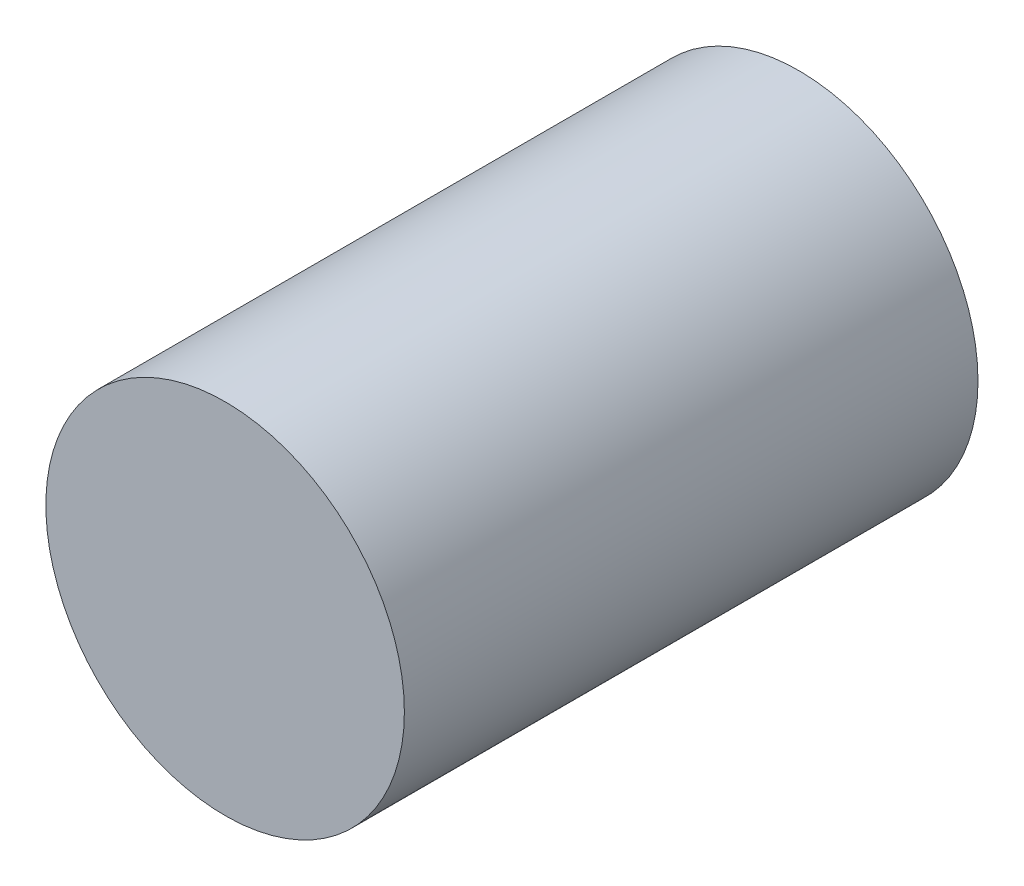
ISO-10303-21;
HEADER;
FILE_DESCRIPTION(('STEP AP214'),'2;1');
FILE_NAME('part.step','',(''),(''),'','','');
FILE_SCHEMA(('AUTOMOTIVE_DESIGN { 1 0 10303 214 1 1 1 1 }'));
ENDSEC;
DATA;
#1=APPLICATION_CONTEXT('core data for automotive mechanical design processes');
#2=APPLICATION_PROTOCOL_DEFINITION('international standard','automotive_design',2000,#1);
#3=PRODUCT_CONTEXT('',#1,'mechanical');
#4=PRODUCT('Part','Part','',(#3));
#5=PRODUCT_RELATED_PRODUCT_CATEGORY('part','',(#4));
#6=PRODUCT_DEFINITION_FORMATION('','',#4);
#7=PRODUCT_DEFINITION_CONTEXT('part definition',#1,'design');
#8=PRODUCT_DEFINITION('design','',#6,#7);
#9=PRODUCT_DEFINITION_SHAPE('','',#8);
#10=(LENGTH_UNIT() NAMED_UNIT(*) SI_UNIT(.MILLI.,.METRE.));
#11=(NAMED_UNIT(*) PLANE_ANGLE_UNIT() SI_UNIT($,.RADIAN.));
#12=(NAMED_UNIT(*) SI_UNIT($,.STERADIAN.) SOLID_ANGLE_UNIT());
#13=UNCERTAINTY_MEASURE_WITH_UNIT(LENGTH_MEASURE(1.E-05),#10,'distance_accuracy_value','');
#14=(GEOMETRIC_REPRESENTATION_CONTEXT(3) GLOBAL_UNCERTAINTY_ASSIGNED_CONTEXT((#13)) GLOBAL_UNIT_ASSIGNED_CONTEXT((#10,
#11,#12)) REPRESENTATION_CONTEXT('',''));
#15=CARTESIAN_POINT('',(0.,0.,0.));
#16=DIRECTION('',(0.,0.,1.));
#17=DIRECTION('',(1.,0.,0.));
#18=AXIS2_PLACEMENT_3D('',#15,#16,#17);
#19=CARTESIAN_POINT('',(-5.79767482026887,10.1400381136833,8.));
#20=DIRECTION('',(0.,0.,-1.));
#21=DIRECTION('',(-1.,0.,0.));
#22=AXIS2_PLACEMENT_3D('',#19,#20,#21);
#23=CYLINDRICAL_SURFACE('',#22,2.5);
#24=CARTESIAN_POINT('',(-5.79767482026887,10.1400381136833,8.));
#25=DIRECTION('',(0.,0.,1.));
#26=DIRECTION('',(1.,0.,0.));
#27=AXIS2_PLACEMENT_3D('',#24,#25,#26);
#28=CIRCLE('',#27,2.5);
#29=CARTESIAN_POINT('',(-3.29767482026887,10.1400381136833,8.));
#30=VERTEX_POINT('',#29);
#31=EDGE_CURVE('E10',#30,#30,#28,.T.);
#32=ORIENTED_EDGE('',*,*,#31,.F.);
#33=EDGE_LOOP('',(#32));
#34=FACE_BOUND('',#33,.T.);
#35=CARTESIAN_POINT('',(-5.79767482026887,10.1400381136833,0.));
#36=DIRECTION('',(0.,0.,1.));
#37=DIRECTION('',(1.,0.,0.));
#38=AXIS2_PLACEMENT_3D('',#35,#36,#37);
#39=CIRCLE('',#38,2.5);
#40=CARTESIAN_POINT('',(-3.29767482026887,10.1400381136833,0.));
#41=VERTEX_POINT('',#40);
#42=EDGE_CURVE('E36',#41,#41,#39,.T.);
#43=ORIENTED_EDGE('',*,*,#42,.T.);
#44=EDGE_LOOP('',(#43));
#45=FACE_BOUND('',#44,.T.);
#46=ADVANCED_FACE('F33',(#34,#45),#23,.T.);
#47=CARTESIAN_POINT('',(-5.79767482026887,10.1400381136833,8.));
#48=DIRECTION('',(0.,0.,1.));
#49=DIRECTION('',(1.,0.,0.));
#50=AXIS2_PLACEMENT_3D('',#47,#48,#49);
#51=PLANE('',#50);
#52=ORIENTED_EDGE('',*,*,#31,.T.);
#53=EDGE_LOOP('',(#52));
#54=FACE_BOUND('',#53,.T.);
#55=ADVANCED_FACE('F48',(#54),#51,.T.);
#56=CARTESIAN_POINT('',(-5.79767482026887,10.1400381136833,0.));
#57=DIRECTION('',(0.,0.,1.));
#58=DIRECTION('',(1.,0.,0.));
#59=AXIS2_PLACEMENT_3D('',#56,#57,#58);
#60=PLANE('',#59);
#61=ORIENTED_EDGE('',*,*,#42,.F.);
#62=EDGE_LOOP('',(#61));
#63=FACE_BOUND('',#62,.T.);
#64=ADVANCED_FACE('F46',(#63),#60,.F.);
#65=CLOSED_SHELL('',(#46,#55,#64));
#66=MANIFOLD_SOLID_BREP('B2',#65);
#67=ADVANCED_BREP_SHAPE_REPRESENTATION('',(#18,#66),#14);
#68=SHAPE_DEFINITION_REPRESENTATION(#9,#67);
ENDSEC;
END-ISO-10303-21;
